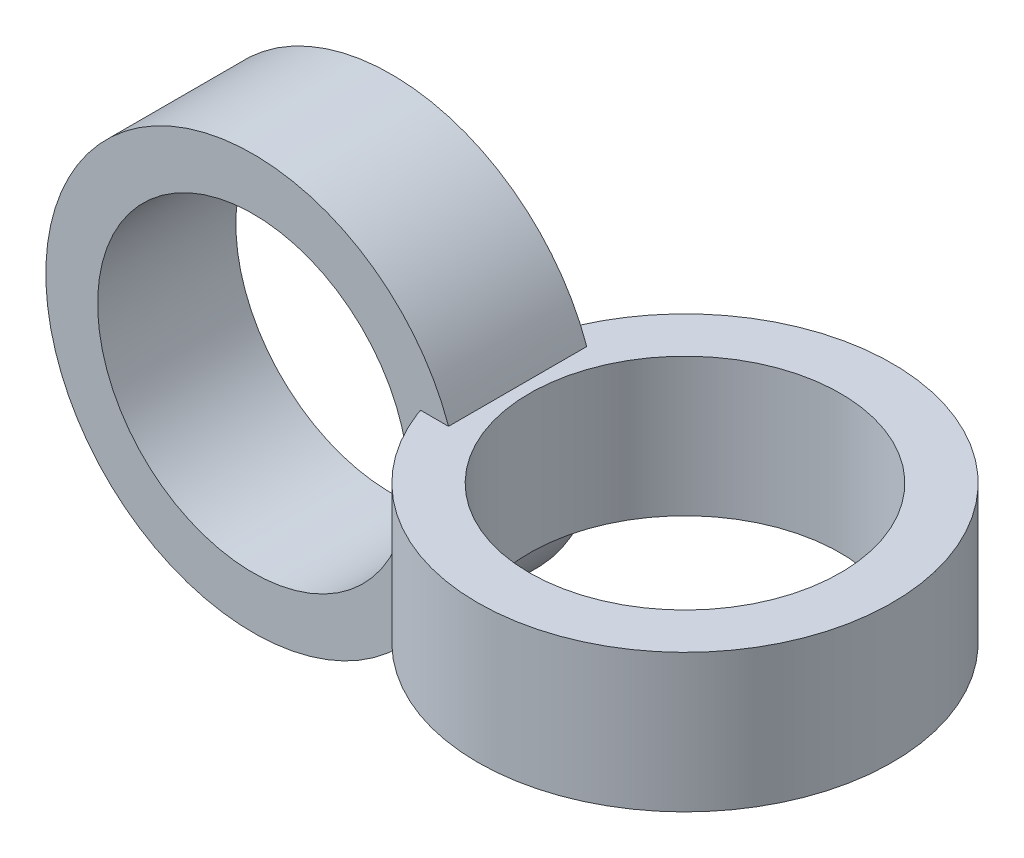
ISO-10303-21;
HEADER;
FILE_DESCRIPTION(('STEP AP214'),'2;1');
FILE_NAME('part.step','',(''),(''),'','','');
FILE_SCHEMA(('AUTOMOTIVE_DESIGN { 1 0 10303 214 1 1 1 1 }'));
ENDSEC;
DATA;
#1=APPLICATION_CONTEXT('core data for automotive mechanical design processes');
#2=APPLICATION_PROTOCOL_DEFINITION('international standard','automotive_design',2000,#1);
#3=PRODUCT_CONTEXT('',#1,'mechanical');
#4=PRODUCT('Part','Part','',(#3));
#5=PRODUCT_RELATED_PRODUCT_CATEGORY('part','',(#4));
#6=PRODUCT_DEFINITION_FORMATION('','',#4);
#7=PRODUCT_DEFINITION_CONTEXT('part definition',#1,'design');
#8=PRODUCT_DEFINITION('design','',#6,#7);
#9=PRODUCT_DEFINITION_SHAPE('','',#8);
#10=(LENGTH_UNIT() NAMED_UNIT(*) SI_UNIT(.MILLI.,.METRE.));
#11=(NAMED_UNIT(*) PLANE_ANGLE_UNIT() SI_UNIT($,.RADIAN.));
#12=(NAMED_UNIT(*) SI_UNIT($,.STERADIAN.) SOLID_ANGLE_UNIT());
#13=UNCERTAINTY_MEASURE_WITH_UNIT(LENGTH_MEASURE(1.E-05),#10,'distance_accuracy_value','');
#14=(GEOMETRIC_REPRESENTATION_CONTEXT(3) GLOBAL_UNCERTAINTY_ASSIGNED_CONTEXT((#13)) GLOBAL_UNIT_ASSIGNED_CONTEXT((#10,
#11,#12)) REPRESENTATION_CONTEXT('',''));
#15=CARTESIAN_POINT('',(0.,0.,0.));
#16=DIRECTION('',(0.,0.,1.));
#17=DIRECTION('',(1.,0.,0.));
#18=AXIS2_PLACEMENT_3D('',#15,#16,#17);
#19=CARTESIAN_POINT('',(168.,-32.,0.));
#20=DIRECTION('',(0.,1.,0.));
#21=DIRECTION('',(0.,0.,1.));
#22=AXIS2_PLACEMENT_3D('',#19,#20,#21);
#23=CYLINDRICAL_SURFACE('',#22,96.0000000000001);
#24=CARTESIAN_POINT('',(168.,-32.,0.));
#25=DIRECTION('',(0.,1.,0.));
#26=DIRECTION('',(0.,0.,1.));
#27=AXIS2_PLACEMENT_3D('',#24,#25,#26);
#28=CIRCLE('',#27,96.0000000000001);
#29=CARTESIAN_POINT('',(168.,-32.,96.0000000000001));
#30=VERTEX_POINT('',#29);
#31=EDGE_CURVE('E11',#30,#30,#28,.T.);
#32=ORIENTED_EDGE('',*,*,#31,.T.);
#33=EDGE_LOOP('',(#32));
#34=FACE_BOUND('',#33,.T.);
#35=CARTESIAN_POINT('',(168.,32.,0.));
#36=DIRECTION('',(0.,1.,0.));
#37=DIRECTION('',(0.,0.,1.));
#38=AXIS2_PLACEMENT_3D('',#35,#36,#37);
#39=CIRCLE('',#38,96.0000000000001);
#40=CARTESIAN_POINT('',(168.,32.,96.0000000000001));
#41=VERTEX_POINT('',#40);
#42=EDGE_CURVE('E57',#41,#41,#39,.T.);
#43=ORIENTED_EDGE('',*,*,#42,.F.);
#44=EDGE_LOOP('',(#43));
#45=FACE_BOUND('',#44,.T.);
#46=ADVANCED_FACE('F45',(#34,#45),#23,.T.);
#47=CARTESIAN_POINT('',(168.,-32.,0.));
#48=DIRECTION('',(0.,1.,0.));
#49=DIRECTION('',(0.,0.,1.));
#50=AXIS2_PLACEMENT_3D('',#47,#48,#49);
#51=PLANE('',#50);
#52=CARTESIAN_POINT('',(168.,-32.,0.));
#53=DIRECTION('',(0.,1.,0.));
#54=DIRECTION('',(0.,0.,1.));
#55=AXIS2_PLACEMENT_3D('',#52,#53,#54);
#56=CIRCLE('',#55,72.0000000000001);
#57=CARTESIAN_POINT('',(168.,-32.,72.0000000000001));
#58=VERTEX_POINT('',#57);
#59=EDGE_CURVE('E52',#58,#58,#56,.T.);
#60=ORIENTED_EDGE('',*,*,#59,.T.);
#61=EDGE_LOOP('',(#60));
#62=FACE_BOUND('',#61,.T.);
#63=ORIENTED_EDGE('',*,*,#31,.F.);
#64=EDGE_LOOP('',(#63));
#65=FACE_BOUND('',#64,.T.);
#66=ADVANCED_FACE('F78',(#62,#65),#51,.F.);
#67=CARTESIAN_POINT('',(168.,-32.,0.));
#68=DIRECTION('',(0.,1.,0.));
#69=DIRECTION('',(0.,0.,1.));
#70=AXIS2_PLACEMENT_3D('',#67,#68,#69);
#71=CYLINDRICAL_SURFACE('',#70,72.0000000000001);
#72=ORIENTED_EDGE('',*,*,#59,.F.);
#73=EDGE_LOOP('',(#72));
#74=FACE_BOUND('',#73,.T.);
#75=CARTESIAN_POINT('',(168.,32.,0.));
#76=DIRECTION('',(0.,1.,0.));
#77=DIRECTION('',(0.,0.,1.));
#78=AXIS2_PLACEMENT_3D('',#75,#76,#77);
#79=CIRCLE('',#78,72.0000000000001);
#80=CARTESIAN_POINT('',(168.,32.,72.0000000000001));
#81=VERTEX_POINT('',#80);
#82=EDGE_CURVE('E62',#81,#81,#79,.T.);
#83=ORIENTED_EDGE('',*,*,#82,.T.);
#84=EDGE_LOOP('',(#83));
#85=FACE_BOUND('',#84,.T.);
#86=ADVANCED_FACE('F69',(#74,#85),#71,.F.);
#87=CARTESIAN_POINT('',(168.,32.,0.));
#88=DIRECTION('',(0.,1.,0.));
#89=DIRECTION('',(0.,0.,1.));
#90=AXIS2_PLACEMENT_3D('',#87,#88,#89);
#91=PLANE('',#90);
#92=ORIENTED_EDGE('',*,*,#42,.T.);
#93=EDGE_LOOP('',(#92));
#94=FACE_BOUND('',#93,.T.);
#95=ORIENTED_EDGE('',*,*,#82,.F.);
#96=EDGE_LOOP('',(#95));
#97=FACE_BOUND('',#96,.T.);
#98=ADVANCED_FACE('F71',(#94,#97),#91,.T.);
#99=CLOSED_SHELL('',(#46,#66,#86,#98));
#100=MANIFOLD_SOLID_BREP('B2',#99);
#101=CARTESIAN_POINT('',(0.,0.,-32.));
#102=DIRECTION('',(0.,0.,1.));
#103=DIRECTION('',(1.,0.,0.));
#104=AXIS2_PLACEMENT_3D('',#101,#102,#103);
#105=CYLINDRICAL_SURFACE('',#104,96.);
#106=CARTESIAN_POINT('',(0.,0.,-32.));
#107=DIRECTION('',(0.,0.,1.));
#108=DIRECTION('',(1.,0.,0.));
#109=AXIS2_PLACEMENT_3D('',#106,#107,#108);
#110=CIRCLE('',#109,96.);
#111=CARTESIAN_POINT('',(96.,0.,-32.));
#112=VERTEX_POINT('',#111);
#113=EDGE_CURVE('E44',#112,#112,#110,.T.);
#114=ORIENTED_EDGE('',*,*,#113,.T.);
#115=EDGE_LOOP('',(#114));
#116=FACE_BOUND('',#115,.T.);
#117=CARTESIAN_POINT('',(0.,0.,32.));
#118=DIRECTION('',(0.,0.,1.));
#119=DIRECTION('',(1.,0.,0.));
#120=AXIS2_PLACEMENT_3D('',#117,#118,#119);
#121=CIRCLE('',#120,96.);
#122=CARTESIAN_POINT('',(96.,0.,32.));
#123=VERTEX_POINT('',#122);
#124=EDGE_CURVE('E121',#123,#123,#121,.T.);
#125=ORIENTED_EDGE('',*,*,#124,.F.);
#126=EDGE_LOOP('',(#125));
#127=FACE_BOUND('',#126,.T.);
#128=ADVANCED_FACE('F111',(#116,#127),#105,.T.);
#129=CARTESIAN_POINT('',(0.,0.,-32.));
#130=DIRECTION('',(0.,0.,1.));
#131=DIRECTION('',(1.,0.,0.));
#132=AXIS2_PLACEMENT_3D('',#129,#130,#131);
#133=PLANE('',#132);
#134=CARTESIAN_POINT('',(0.,0.,-32.));
#135=DIRECTION('',(0.,0.,1.));
#136=DIRECTION('',(1.,0.,0.));
#137=AXIS2_PLACEMENT_3D('',#134,#135,#136);
#138=CIRCLE('',#137,72.);
#139=CARTESIAN_POINT('',(72.,0.,-32.));
#140=VERTEX_POINT('',#139);
#141=EDGE_CURVE('E117',#140,#140,#138,.T.);
#142=ORIENTED_EDGE('',*,*,#141,.T.);
#143=EDGE_LOOP('',(#142));
#144=FACE_BOUND('',#143,.T.);
#145=ORIENTED_EDGE('',*,*,#113,.F.);
#146=EDGE_LOOP('',(#145));
#147=FACE_BOUND('',#146,.T.);
#148=ADVANCED_FACE('F140',(#144,#147),#133,.F.);
#149=CARTESIAN_POINT('',(0.,0.,-32.));
#150=DIRECTION('',(0.,0.,1.));
#151=DIRECTION('',(1.,0.,0.));
#152=AXIS2_PLACEMENT_3D('',#149,#150,#151);
#153=CYLINDRICAL_SURFACE('',#152,72.);
#154=ORIENTED_EDGE('',*,*,#141,.F.);
#155=EDGE_LOOP('',(#154));
#156=FACE_BOUND('',#155,.T.);
#157=CARTESIAN_POINT('',(0.,0.,32.));
#158=DIRECTION('',(0.,0.,1.));
#159=DIRECTION('',(1.,0.,0.));
#160=AXIS2_PLACEMENT_3D('',#157,#158,#159);
#161=CIRCLE('',#160,72.);
#162=CARTESIAN_POINT('',(72.,0.,32.));
#163=VERTEX_POINT('',#162);
#164=EDGE_CURVE('E125',#163,#163,#161,.T.);
#165=ORIENTED_EDGE('',*,*,#164,.T.);
#166=EDGE_LOOP('',(#165));
#167=FACE_BOUND('',#166,.T.);
#168=ADVANCED_FACE('F131',(#156,#167),#153,.F.);
#169=CARTESIAN_POINT('',(0.,0.,32.));
#170=DIRECTION('',(0.,0.,1.));
#171=DIRECTION('',(1.,0.,0.));
#172=AXIS2_PLACEMENT_3D('',#169,#170,#171);
#173=PLANE('',#172);
#174=ORIENTED_EDGE('',*,*,#124,.T.);
#175=EDGE_LOOP('',(#174));
#176=FACE_BOUND('',#175,.T.);
#177=ORIENTED_EDGE('',*,*,#164,.F.);
#178=EDGE_LOOP('',(#177));
#179=FACE_BOUND('',#178,.T.);
#180=ADVANCED_FACE('F133',(#176,#179),#173,.T.);
#181=CLOSED_SHELL('',(#128,#148,#168,#180));
#182=MANIFOLD_SOLID_BREP('B6',#181);
#183=ADVANCED_BREP_SHAPE_REPRESENTATION('',(#18,#100,#182),#14);
#184=SHAPE_DEFINITION_REPRESENTATION(#9,#183);
ENDSEC;
END-ISO-10303-21;
